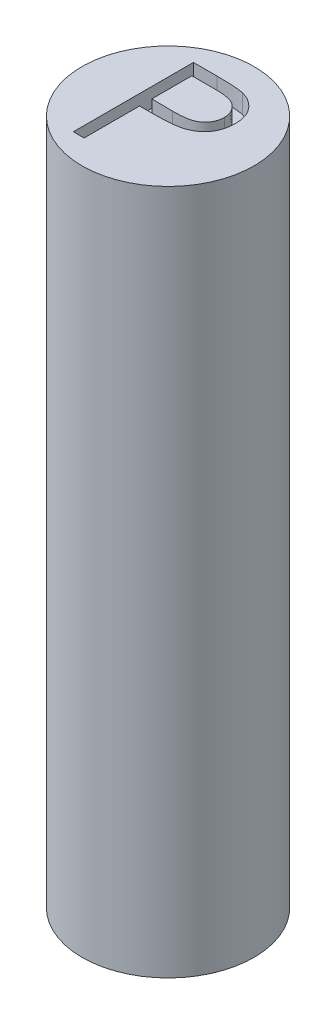
ISO-10303-21;
HEADER;
FILE_DESCRIPTION(('STEP AP214'),'2;1');
FILE_NAME('part.step','',(''),(''),'','','');
FILE_SCHEMA(('AUTOMOTIVE_DESIGN { 1 0 10303 214 1 1 1 1 }'));
ENDSEC;
DATA;
#1=APPLICATION_CONTEXT('core data for automotive mechanical design processes');
#2=APPLICATION_PROTOCOL_DEFINITION('international standard','automotive_design',2000,#1);
#3=PRODUCT_CONTEXT('',#1,'mechanical');
#4=PRODUCT('Part','Part','',(#3));
#5=PRODUCT_RELATED_PRODUCT_CATEGORY('part','',(#4));
#6=PRODUCT_DEFINITION_FORMATION('','',#4);
#7=PRODUCT_DEFINITION_CONTEXT('part definition',#1,'design');
#8=PRODUCT_DEFINITION('design','',#6,#7);
#9=PRODUCT_DEFINITION_SHAPE('','',#8);
#10=(LENGTH_UNIT() NAMED_UNIT(*) SI_UNIT(.MILLI.,.METRE.));
#11=(NAMED_UNIT(*) PLANE_ANGLE_UNIT() SI_UNIT($,.RADIAN.));
#12=(NAMED_UNIT(*) SI_UNIT($,.STERADIAN.) SOLID_ANGLE_UNIT());
#13=UNCERTAINTY_MEASURE_WITH_UNIT(LENGTH_MEASURE(1.E-05),#10,'distance_accuracy_value','');
#14=(GEOMETRIC_REPRESENTATION_CONTEXT(3) GLOBAL_UNCERTAINTY_ASSIGNED_CONTEXT((#13)) GLOBAL_UNIT_ASSIGNED_CONTEXT((#10,
#11,#12)) REPRESENTATION_CONTEXT('',''));
#15=CARTESIAN_POINT('',(0.,0.,0.));
#16=DIRECTION('',(0.,0.,1.));
#17=DIRECTION('',(1.,0.,0.));
#18=AXIS2_PLACEMENT_3D('',#15,#16,#17);
#19=CARTESIAN_POINT('',(0.,72.5,0.));
#20=DIRECTION('',(0.,1.,0.));
#21=DIRECTION('',(0.,0.,1.));
#22=AXIS2_PLACEMENT_3D('',#19,#20,#21);
#23=PLANE('',#22);
#24=CARTESIAN_POINT('',(0.,72.5,0.));
#25=DIRECTION('',(0.,1.,0.));
#26=DIRECTION('',(0.,0.,1.));
#27=AXIS2_PLACEMENT_3D('',#24,#25,#26);
#28=CIRCLE('',#27,9.1);
#29=CARTESIAN_POINT('',(0.,72.5,9.1));
#30=VERTEX_POINT('',#29);
#31=EDGE_CURVE('E11',#30,#30,#28,.T.);
#32=ORIENTED_EDGE('',*,*,#31,.T.);
#33=EDGE_LOOP('',(#32));
#34=FACE_BOUND('',#33,.T.);
#35=DIRECTION('',(-1.,0.,0.));
#36=VECTOR('',#35,1.);
#37=CARTESIAN_POINT('',(-2.44230769230769,72.5,6.43467170879758));
#38=LINE('',#37,#36);
#39=CARTESIAN_POINT('',(-2.44230769230769,72.5,6.43467170879758));
#40=VERTEX_POINT('',#39);
#41=CARTESIAN_POINT('',(-3.58205128205128,72.5,6.43467170879758));
#42=VERTEX_POINT('',#41);
#43=EDGE_CURVE('E281',#40,#42,#38,.T.);
#44=ORIENTED_EDGE('',*,*,#43,.T.);
#45=DIRECTION('',(0.,0.,-1.));
#46=VECTOR('',#45,1.);
#47=CARTESIAN_POINT('',(-3.58205128205128,72.5,6.43467170879758));
#48=LINE('',#47,#46);
#49=CARTESIAN_POINT('',(-3.58205128205128,72.5,-6.26532829120242));
#50=VERTEX_POINT('',#49);
#51=EDGE_CURVE('E47',#42,#50,#48,.T.);
#52=ORIENTED_EDGE('',*,*,#51,.T.);
#53=DIRECTION('',(1.,0.,0.));
#54=VECTOR('',#53,1.);
#55=CARTESIAN_POINT('',(-3.58205128205128,72.5,-6.26532829120242));
#56=LINE('',#55,#54);
#57=CARTESIAN_POINT('',(-1.09140625,72.5,-6.26532829120242));
#58=VERTEX_POINT('',#57);
#59=EDGE_CURVE('E240',#50,#58,#56,.T.);
#60=ORIENTED_EDGE('',*,*,#59,.T.);
#61=CARTESIAN_POINT('',(-1.09140625,72.5,-6.26532829120242));
#62=CARTESIAN_POINT('',(-0.920098104821111,72.5,-6.26513998198564));
#63=CARTESIAN_POINT('',(-0.591864090908021,72.5,-6.26477917316353));
#64=CARTESIAN_POINT('',(-0.121183745907202,72.5,-6.25383995259619));
#65=CARTESIAN_POINT('',(0.306297280279791,72.5,-6.23922881271673));
#66=CARTESIAN_POINT('',(0.689657233928184,72.5,-6.21897451455883));
#67=CARTESIAN_POINT('',(1.03007564698521,72.5,-6.19503831566073));
#68=CARTESIAN_POINT('',(1.32601213391129,72.5,-6.16146662991978));
#69=CARTESIAN_POINT('',(1.57979280975124,72.5,-6.12641355748342));
#70=CARTESIAN_POINT('',(1.73185335488574,72.5,-6.09077588239876));
#71=CARTESIAN_POINT('',(1.80120192307692,72.5,-6.07452300274088));
#72=B_SPLINE_CURVE_WITH_KNOTS('',3,(#61,#62,#63,#64,#65,#66,#67,#68,#69,#70,#71),.UNSPECIFIED.,
.F.,.F.,(4,1,1,1,1,1,1,1,4),(0.,0.176955752131251,0.339055079642581,0.486318224942077,
0.618780922835378,0.735618827767381,0.838742476720111,0.926457067876317,1.),.UNSPECIFIED.);
#73=CARTESIAN_POINT('',(1.80120192307692,72.5,-6.07452300274088));
#74=VERTEX_POINT('',#73);
#75=EDGE_CURVE('E243',#58,#74,#72,.T.);
#76=ORIENTED_EDGE('',*,*,#75,.T.);
#77=CARTESIAN_POINT('',(1.80120192307692,72.5,-6.07452300274088));
#78=CARTESIAN_POINT('',(1.88898988852641,72.5,-6.05049478478014));
#79=CARTESIAN_POINT('',(2.06249720583904,72.5,-6.0030045437565));
#80=CARTESIAN_POINT('',(2.31250956223637,72.5,-5.90788617571631));
#81=CARTESIAN_POINT('',(2.55037637297944,72.5,-5.79510231922238));
#82=CARTESIAN_POINT('',(2.77691374219481,72.5,-5.66656402319198));
#83=CARTESIAN_POINT('',(2.98933787219484,72.5,-5.51675640457007));
#84=CARTESIAN_POINT('',(3.19081807798578,72.5,-5.3517521344875));
#85=CARTESIAN_POINT('',(3.3795762922016,72.5,-5.16774158566754));
#86=CARTESIAN_POINT('',(3.55455105703846,72.5,-4.96678861536399));
#87=CARTESIAN_POINT('',(3.71524160827164,72.5,-4.75226671093685));
#88=CARTESIAN_POINT('',(3.85359788559597,72.5,-4.52097347670111));
#89=CARTESIAN_POINT('',(3.96944810940238,72.5,-4.27680217572056));
#90=CARTESIAN_POINT('',(4.06881026593061,72.5,-4.01992264609249));
#91=CARTESIAN_POINT('',(4.14032380071884,72.5,-3.74817775799536));
#92=CARTESIAN_POINT('',(4.19419683679291,72.5,-3.46345568738045));
#93=CARTESIAN_POINT('',(4.22839114271255,72.5,-3.16578695436359));
#94=CARTESIAN_POINT('',(4.23166615250978,72.5,-2.96236972078789));
#95=CARTESIAN_POINT('',(4.23333333333334,72.5,-2.85881787453575));
#96=B_SPLINE_CURVE_WITH_KNOTS('',3,(#77,#78,#79,#80,#81,#82,#83,#84,#85,#86,#87,#88,#89,#90,#91,
#92,#93,#94,#95),.UNSPECIFIED.,.F.,.F.,(4,1,1,1,1,1,1,1,1,1,1,1,1,1,1,1,4),(0.,
0.0624813386352052,0.123490382687291,0.183411094206311,0.24315322099978,0.302126735372088,
0.361709670832906,0.42184229169488,0.482931901446669,0.544552254431324,0.605680719965358,
0.667679738343688,0.729984387538063,0.794550921286129,0.860345619712083,0.928907356265709,1.),.UNSPECIFIED.);
#97=CARTESIAN_POINT('',(4.23333333333334,72.5,-2.85881787453575));
#98=VERTEX_POINT('',#97);
#99=EDGE_CURVE('E248',#74,#98,#96,.T.);
#100=ORIENTED_EDGE('',*,*,#99,.T.);
#101=CARTESIAN_POINT('',(4.23333333333334,72.5,-2.85881787453575));
#102=CARTESIAN_POINT('',(4.23180416360254,72.5,-2.75439565590688));
#103=CARTESIAN_POINT('',(4.22881223974359,72.5,-2.5500865324476));
#104=CARTESIAN_POINT('',(4.19290286155038,72.5,-2.25119098673435));
#105=CARTESIAN_POINT('',(4.14453330910533,72.5,-1.9655556853997));
#106=CARTESIAN_POINT('',(4.07015829066092,72.5,-1.69381396512494));
#107=CARTESIAN_POINT('',(3.97274684827528,72.5,-1.43757959798816));
#108=CARTESIAN_POINT('',(3.85847568509235,72.5,-1.19293684179862));
#109=CARTESIAN_POINT('',(3.72064973203631,72.5,-0.964047746623712));
#110=CARTESIAN_POINT('',(3.56228134994392,72.5,-0.750081348686854));
#111=CARTESIAN_POINT('',(3.38610842171828,72.5,-0.550836809718299));
#112=CARTESIAN_POINT('',(3.19287633186965,72.5,-0.367757983987628));
#113=CARTESIAN_POINT('',(2.98336518479725,72.5,-0.201916527425883));
#114=CARTESIAN_POINT('',(2.75824081892016,72.5,-0.0529406517856198));
#115=CARTESIAN_POINT('',(2.51530851028471,72.5,0.0757149909631279));
#116=CARTESIAN_POINT('',(2.25825269589871,72.5,0.190948640264351));
#117=CARTESIAN_POINT('',(1.98483905345345,72.5,0.287726488866887));
#118=CARTESIAN_POINT('',(1.79563621702854,72.5,0.338635568899814));
#119=CARTESIAN_POINT('',(1.6994391025641,72.5,0.36451946520784));
#120=B_SPLINE_CURVE_WITH_KNOTS('',3,(#101,#102,#103,#104,#105,#106,#107,#108,#109,#110,#111,
#112,#113,#114,#115,#116,#117,#118,#119),.UNSPECIFIED.,.F.,.F.,(4,1,1,1,1,1,1,1,1,1,1,1,1,1,1,1,
4),(0.,0.0701188944197149,0.137192352785971,0.202016180724751,0.264631406974743,
0.326116547145818,0.386010304667641,0.44581184695768,0.50529769673096,0.564633277726488,
0.62428262533384,0.683902031903751,0.74395277093827,0.805387731007635,0.86838803089628,
0.933084028252477,1.),.UNSPECIFIED.);
#121=CARTESIAN_POINT('',(1.6994391025641,72.5,0.36451946520784));
#122=VERTEX_POINT('',#121);
#123=EDGE_CURVE('E256',#98,#122,#120,.T.);
#124=ORIENTED_EDGE('',*,*,#123,.T.);
#125=CARTESIAN_POINT('',(1.6994391025641,72.5,0.36451946520784));
#126=CARTESIAN_POINT('',(1.61987420493812,72.5,0.381439425119047));
#127=CARTESIAN_POINT('',(1.44550310565819,72.5,0.418520501039717));
#128=CARTESIAN_POINT('',(1.15832808518465,72.5,0.459916901591152));
#129=CARTESIAN_POINT('',(0.823971970525023,72.5,0.495250481221207));
#130=CARTESIAN_POINT('',(0.442891126259966,72.5,0.521743180443899));
#131=CARTESIAN_POINT('',(0.0154276141159625,72.5,0.544423088863187));
#132=CARTESIAN_POINT('',(-0.458649805337677,72.5,0.562450172409361));
#133=CARTESIAN_POINT('',(-0.980271742531171,72.5,0.572355642039793));
#134=CARTESIAN_POINT('',(-1.34411311389976,72.5,0.572866518765746));
#135=CARTESIAN_POINT('',(-1.53407451923077,72.5,0.573133247259122));
#136=B_SPLINE_CURVE_WITH_KNOTS('',3,(#125,#126,#127,#128,#129,#130,#131,#132,#133,#134,#135),
.UNSPECIFIED.,.F.,.F.,(4,1,1,1,1,1,1,1,4),(0.,0.0751731173762218,0.164746257511801,
0.26801688098778,0.385911875652956,0.517789479273397,0.663690977002281,0.824413220536641,1.),.UNSPECIFIED.);
#137=CARTESIAN_POINT('',(-1.53407451923077,72.5,0.573133247259122));
#138=VERTEX_POINT('',#137);
#139=EDGE_CURVE('E264',#122,#138,#136,.T.);
#140=ORIENTED_EDGE('',*,*,#139,.T.);
#141=DIRECTION('',(-1.,0.,0.));
#142=VECTOR('',#141,1.);
#143=CARTESIAN_POINT('',(-1.53407451923077,72.5,0.573133247259122));
#144=LINE('',#143,#142);
#145=CARTESIAN_POINT('',(-2.44230769230769,72.5,0.573133247259122));
#146=VERTEX_POINT('',#145);
#147=EDGE_CURVE('E272',#138,#146,#144,.T.);
#148=ORIENTED_EDGE('',*,*,#147,.T.);
#149=DIRECTION('',(0.,0.,1.));
#150=VECTOR('',#149,1.);
#151=CARTESIAN_POINT('',(-2.44230769230769,72.5,0.573133247259122));
#152=LINE('',#151,#150);
#153=EDGE_CURVE('E278',#146,#40,#152,.T.);
#154=ORIENTED_EDGE('',*,*,#153,.T.);
#155=EDGE_LOOP('',(#44,#52,#60,#76,#100,#124,#140,#148,#154));
#156=FACE_BOUND('',#155,.T.);
#157=ADVANCED_FACE('F32',(#34,#156),#23,.T.);
#158=CARTESIAN_POINT('',(0.,72.5,0.));
#159=DIRECTION('',(0.,-1.,0.));
#160=DIRECTION('',(0.,0.,-1.));
#161=AXIS2_PLACEMENT_3D('',#158,#159,#160);
#162=CYLINDRICAL_SURFACE('',#161,9.1);
#163=ORIENTED_EDGE('',*,*,#31,.F.);
#164=EDGE_LOOP('',(#163));
#165=FACE_BOUND('',#164,.T.);
#166=CARTESIAN_POINT('',(0.,0.,0.));
#167=DIRECTION('',(0.,1.,0.));
#168=DIRECTION('',(0.,0.,1.));
#169=AXIS2_PLACEMENT_3D('',#166,#167,#168);
#170=CIRCLE('',#169,9.1);
#171=CARTESIAN_POINT('',(0.,0.,9.1));
#172=VERTEX_POINT('',#171);
#173=EDGE_CURVE('E36',#172,#172,#170,.T.);
#174=ORIENTED_EDGE('',*,*,#173,.T.);
#175=EDGE_LOOP('',(#174));
#176=FACE_BOUND('',#175,.T.);
#177=ADVANCED_FACE('F34',(#165,#176),#162,.T.);
#178=CARTESIAN_POINT('',(0.,0.,0.));
#179=DIRECTION('',(0.,1.,0.));
#180=DIRECTION('',(0.,0.,1.));
#181=AXIS2_PLACEMENT_3D('',#178,#179,#180);
#182=PLANE('',#181);
#183=ORIENTED_EDGE('',*,*,#173,.F.);
#184=EDGE_LOOP('',(#183));
#185=FACE_BOUND('',#184,.T.);
#186=ADVANCED_FACE('F307',(#185),#182,.F.);
#187=CARTESIAN_POINT('',(-3.58205128205128,70.5,6.43467170879758));
#188=DIRECTION('',(1.,0.,0.));
#189=DIRECTION('',(0.,0.,-1.));
#190=AXIS2_PLACEMENT_3D('',#187,#188,#189);
#191=PLANE('',#190);
#192=ORIENTED_EDGE('',*,*,#51,.F.);
#193=DIRECTION('',(0.,1.,0.));
#194=VECTOR('',#193,1.);
#195=CARTESIAN_POINT('',(-3.58205128205128,70.5,6.43467170879758));
#196=LINE('',#195,#194);
#197=CARTESIAN_POINT('',(-3.58205128205128,70.5,6.43467170879758));
#198=VERTEX_POINT('',#197);
#199=EDGE_CURVE('E238',#198,#42,#196,.T.);
#200=ORIENTED_EDGE('',*,*,#199,.F.);
#201=DIRECTION('',(0.,0.,-1.));
#202=VECTOR('',#201,1.);
#203=CARTESIAN_POINT('',(-3.58205128205128,70.5,6.43467170879758));
#204=LINE('',#203,#202);
#205=CARTESIAN_POINT('',(-3.58205128205128,70.5,-6.26532829120242));
#206=VERTEX_POINT('',#205);
#207=EDGE_CURVE('E284',#198,#206,#204,.T.);
#208=ORIENTED_EDGE('',*,*,#207,.T.);
#209=DIRECTION('',(0.,1.,0.));
#210=VECTOR('',#209,1.);
#211=CARTESIAN_POINT('',(-3.58205128205128,70.5,-6.26532829120242));
#212=LINE('',#211,#210);
#213=EDGE_CURVE('E300',#206,#50,#212,.T.);
#214=ORIENTED_EDGE('',*,*,#213,.T.);
#215=EDGE_LOOP('',(#192,#200,#208,#214));
#216=FACE_BOUND('',#215,.T.);
#217=ADVANCED_FACE('F309',(#216),#191,.T.);
#218=CARTESIAN_POINT('',(-3.58205128205128,70.5,-6.26532829120242));
#219=DIRECTION('',(0.,0.,1.));
#220=DIRECTION('',(1.,0.,0.));
#221=AXIS2_PLACEMENT_3D('',#218,#219,#220);
#222=PLANE('',#221);
#223=ORIENTED_EDGE('',*,*,#59,.F.);
#224=ORIENTED_EDGE('',*,*,#213,.F.);
#225=DIRECTION('',(1.,0.,0.));
#226=VECTOR('',#225,1.);
#227=CARTESIAN_POINT('',(-3.58205128205128,70.5,-6.26532829120242));
#228=LINE('',#227,#226);
#229=CARTESIAN_POINT('',(-1.09140625,70.5,-6.26532829120242));
#230=VERTEX_POINT('',#229);
#231=EDGE_CURVE('E353',#206,#230,#228,.T.);
#232=ORIENTED_EDGE('',*,*,#231,.T.);
#233=DIRECTION('',(0.,1.,0.));
#234=VECTOR('',#233,1.);
#235=CARTESIAN_POINT('',(-1.09140625,70.5,-6.26532829120242));
#236=LINE('',#235,#234);
#237=EDGE_CURVE('E298',#230,#58,#236,.T.);
#238=ORIENTED_EDGE('',*,*,#237,.T.);
#239=EDGE_LOOP('',(#223,#224,#232,#238));
#240=FACE_BOUND('',#239,.T.);
#241=ADVANCED_FACE('F314',(#240),#222,.T.);
#242=CARTESIAN_POINT('',(-1.09140625,70.5,-6.26532829120242));
#243=CARTESIAN_POINT('',(-0.920098104821111,70.5,-6.26513998198564));
#244=CARTESIAN_POINT('',(-0.591864090908021,70.5,-6.26477917316353));
#245=CARTESIAN_POINT('',(-0.121183745907202,70.5,-6.25383995259619));
#246=CARTESIAN_POINT('',(0.306297280279791,70.5,-6.23922881271673));
#247=CARTESIAN_POINT('',(0.689657233928184,70.5,-6.21897451455883));
#248=CARTESIAN_POINT('',(1.03007564698521,70.5,-6.19503831566073));
#249=CARTESIAN_POINT('',(1.32601213391129,70.5,-6.16146662991978));
#250=CARTESIAN_POINT('',(1.57979280975124,70.5,-6.12641355748342));
#251=CARTESIAN_POINT('',(1.73185335488574,70.5,-6.09077588239876));
#252=CARTESIAN_POINT('',(1.80120192307692,70.5,-6.07452300274088));
#253=B_SPLINE_CURVE_WITH_KNOTS('',3,(#242,#243,#244,#245,#246,#247,#248,#249,#250,#251,#252),
.UNSPECIFIED.,.F.,.F.,(4,1,1,1,1,1,1,1,4),(0.,0.176955752131251,0.339055079642581,
0.486318224942077,0.618780922835378,0.735618827767381,0.838742476720111,0.926457067876317,1.),.UNSPECIFIED.);
#254=DIRECTION('',(0.,1.,0.));
#255=VECTOR('',#254,1.);
#256=SURFACE_OF_LINEAR_EXTRUSION('',#253,#255);
#257=ORIENTED_EDGE('',*,*,#75,.F.);
#258=ORIENTED_EDGE('',*,*,#237,.F.);
#259=CARTESIAN_POINT('',(1.80120192307692,70.5,-6.07452300274088));
#260=VERTEX_POINT('',#259);
#261=EDGE_CURVE('E355',#230,#260,#253,.T.);
#262=ORIENTED_EDGE('',*,*,#261,.T.);
#263=DIRECTION('',(0.,1.,0.));
#264=VECTOR('',#263,1.);
#265=CARTESIAN_POINT('',(1.80120192307692,70.5,-6.07452300274088));
#266=LINE('',#265,#264);
#267=EDGE_CURVE('E296',#260,#74,#266,.T.);
#268=ORIENTED_EDGE('',*,*,#267,.T.);
#269=EDGE_LOOP('',(#257,#258,#262,#268));
#270=FACE_BOUND('',#269,.T.);
#271=ADVANCED_FACE('F367',(#270),#256,.T.);
#272=CARTESIAN_POINT('',(1.80120192307692,70.5,-6.07452300274088));
#273=CARTESIAN_POINT('',(1.88898988852641,70.5,-6.05049478478014));
#274=CARTESIAN_POINT('',(2.06249720583904,70.5,-6.0030045437565));
#275=CARTESIAN_POINT('',(2.31250956223637,70.5,-5.90788617571631));
#276=CARTESIAN_POINT('',(2.55037637297944,70.5,-5.79510231922238));
#277=CARTESIAN_POINT('',(2.77691374219481,70.5,-5.66656402319198));
#278=CARTESIAN_POINT('',(2.98933787219484,70.5,-5.51675640457007));
#279=CARTESIAN_POINT('',(3.19081807798578,70.5,-5.3517521344875));
#280=CARTESIAN_POINT('',(3.3795762922016,70.5,-5.16774158566754));
#281=CARTESIAN_POINT('',(3.55455105703846,70.5,-4.96678861536399));
#282=CARTESIAN_POINT('',(3.71524160827164,70.5,-4.75226671093685));
#283=CARTESIAN_POINT('',(3.85359788559597,70.5,-4.52097347670111));
#284=CARTESIAN_POINT('',(3.96944810940238,70.5,-4.27680217572056));
#285=CARTESIAN_POINT('',(4.06881026593061,70.5,-4.01992264609249));
#286=CARTESIAN_POINT('',(4.14032380071884,70.5,-3.74817775799536));
#287=CARTESIAN_POINT('',(4.19419683679291,70.5,-3.46345568738045));
#288=CARTESIAN_POINT('',(4.22839114271255,70.5,-3.16578695436359));
#289=CARTESIAN_POINT('',(4.23166615250978,70.5,-2.96236972078789));
#290=CARTESIAN_POINT('',(4.23333333333334,70.5,-2.85881787453575));
#291=B_SPLINE_CURVE_WITH_KNOTS('',3,(#272,#273,#274,#275,#276,#277,#278,#279,#280,#281,#282,
#283,#284,#285,#286,#287,#288,#289,#290),.UNSPECIFIED.,.F.,.F.,(4,1,1,1,1,1,1,1,1,1,1,1,1,1,1,1,
4),(0.,0.0624813386352052,0.123490382687291,0.183411094206311,0.24315322099978,
0.302126735372088,0.361709670832906,0.42184229169488,0.482931901446669,0.544552254431324,
0.605680719965358,0.667679738343688,0.729984387538063,0.794550921286129,0.860345619712083,
0.928907356265709,1.),.UNSPECIFIED.);
#292=DIRECTION('',(0.,1.,0.));
#293=VECTOR('',#292,1.);
#294=SURFACE_OF_LINEAR_EXTRUSION('',#291,#293);
#295=ORIENTED_EDGE('',*,*,#99,.F.);
#296=ORIENTED_EDGE('',*,*,#267,.F.);
#297=CARTESIAN_POINT('',(4.23333333333334,70.5,-2.85881787453575));
#298=VERTEX_POINT('',#297);
#299=EDGE_CURVE('E359',#260,#298,#291,.T.);
#300=ORIENTED_EDGE('',*,*,#299,.T.);
#301=DIRECTION('',(0.,1.,0.));
#302=VECTOR('',#301,1.);
#303=CARTESIAN_POINT('',(4.23333333333334,70.5,-2.85881787453575));
#304=LINE('',#303,#302);
#305=EDGE_CURVE('E294',#298,#98,#304,.T.);
#306=ORIENTED_EDGE('',*,*,#305,.T.);
#307=EDGE_LOOP('',(#295,#296,#300,#306));
#308=FACE_BOUND('',#307,.T.);
#309=ADVANCED_FACE('F370',(#308),#294,.T.);
#310=CARTESIAN_POINT('',(4.23333333333334,70.5,-2.85881787453575));
#311=CARTESIAN_POINT('',(4.23180416360254,70.5,-2.75439565590688));
#312=CARTESIAN_POINT('',(4.22881223974359,70.5,-2.5500865324476));
#313=CARTESIAN_POINT('',(4.19290286155038,70.5,-2.25119098673435));
#314=CARTESIAN_POINT('',(4.14453330910533,70.5,-1.9655556853997));
#315=CARTESIAN_POINT('',(4.07015829066092,70.5,-1.69381396512494));
#316=CARTESIAN_POINT('',(3.97274684827528,70.5,-1.43757959798816));
#317=CARTESIAN_POINT('',(3.85847568509235,70.5,-1.19293684179862));
#318=CARTESIAN_POINT('',(3.72064973203631,70.5,-0.964047746623712));
#319=CARTESIAN_POINT('',(3.56228134994392,70.5,-0.750081348686854));
#320=CARTESIAN_POINT('',(3.38610842171828,70.5,-0.550836809718299));
#321=CARTESIAN_POINT('',(3.19287633186965,70.5,-0.367757983987628));
#322=CARTESIAN_POINT('',(2.98336518479725,70.5,-0.201916527425883));
#323=CARTESIAN_POINT('',(2.75824081892016,70.5,-0.0529406517856198));
#324=CARTESIAN_POINT('',(2.51530851028471,70.5,0.0757149909631279));
#325=CARTESIAN_POINT('',(2.25825269589871,70.5,0.190948640264351));
#326=CARTESIAN_POINT('',(1.98483905345345,70.5,0.287726488866887));
#327=CARTESIAN_POINT('',(1.79563621702854,70.5,0.338635568899814));
#328=CARTESIAN_POINT('',(1.6994391025641,70.5,0.36451946520784));
#329=B_SPLINE_CURVE_WITH_KNOTS('',3,(#310,#311,#312,#313,#314,#315,#316,#317,#318,#319,#320,
#321,#322,#323,#324,#325,#326,#327,#328),.UNSPECIFIED.,.F.,.F.,(4,1,1,1,1,1,1,1,1,1,1,1,1,1,1,1,
4),(0.,0.0701188944197149,0.137192352785971,0.202016180724751,0.264631406974743,
0.326116547145818,0.386010304667641,0.44581184695768,0.50529769673096,0.564633277726488,
0.62428262533384,0.683902031903751,0.74395277093827,0.805387731007635,0.86838803089628,
0.933084028252477,1.),.UNSPECIFIED.);
#330=DIRECTION('',(0.,1.,0.));
#331=VECTOR('',#330,1.);
#332=SURFACE_OF_LINEAR_EXTRUSION('',#329,#331);
#333=ORIENTED_EDGE('',*,*,#123,.F.);
#334=ORIENTED_EDGE('',*,*,#305,.F.);
#335=CARTESIAN_POINT('',(1.6994391025641,70.5,0.36451946520784));
#336=VERTEX_POINT('',#335);
#337=EDGE_CURVE('E225',#298,#336,#329,.T.);
#338=ORIENTED_EDGE('',*,*,#337,.T.);
#339=DIRECTION('',(0.,1.,0.));
#340=VECTOR('',#339,1.);
#341=CARTESIAN_POINT('',(1.6994391025641,70.5,0.36451946520784));
#342=LINE('',#341,#340);
#343=EDGE_CURVE('E292',#336,#122,#342,.T.);
#344=ORIENTED_EDGE('',*,*,#343,.T.);
#345=EDGE_LOOP('',(#333,#334,#338,#344));
#346=FACE_BOUND('',#345,.T.);
#347=ADVANCED_FACE('F215',(#346),#332,.T.);
#348=CARTESIAN_POINT('',(1.6994391025641,70.5,0.36451946520784));
#349=CARTESIAN_POINT('',(1.61987420493812,70.5,0.381439425119047));
#350=CARTESIAN_POINT('',(1.44550310565819,70.5,0.418520501039717));
#351=CARTESIAN_POINT('',(1.15832808518465,70.5,0.459916901591152));
#352=CARTESIAN_POINT('',(0.823971970525023,70.5,0.495250481221207));
#353=CARTESIAN_POINT('',(0.442891126259966,70.5,0.521743180443899));
#354=CARTESIAN_POINT('',(0.0154276141159625,70.5,0.544423088863187));
#355=CARTESIAN_POINT('',(-0.458649805337677,70.5,0.562450172409361));
#356=CARTESIAN_POINT('',(-0.980271742531171,70.5,0.572355642039793));
#357=CARTESIAN_POINT('',(-1.34411311389976,70.5,0.572866518765746));
#358=CARTESIAN_POINT('',(-1.53407451923077,70.5,0.573133247259122));
#359=B_SPLINE_CURVE_WITH_KNOTS('',3,(#348,#349,#350,#351,#352,#353,#354,#355,#356,#357,#358),
.UNSPECIFIED.,.F.,.F.,(4,1,1,1,1,1,1,1,4),(0.,0.0751731173762218,0.164746257511801,
0.26801688098778,0.385911875652956,0.517789479273397,0.663690977002281,0.824413220536641,1.),.UNSPECIFIED.);
#360=DIRECTION('',(0.,1.,0.));
#361=VECTOR('',#360,1.);
#362=SURFACE_OF_LINEAR_EXTRUSION('',#359,#361);
#363=ORIENTED_EDGE('',*,*,#139,.F.);
#364=ORIENTED_EDGE('',*,*,#343,.F.);
#365=CARTESIAN_POINT('',(-1.53407451923077,70.5,0.573133247259122));
#366=VERTEX_POINT('',#365);
#367=EDGE_CURVE('E219',#336,#366,#359,.T.);
#368=ORIENTED_EDGE('',*,*,#367,.T.);
#369=DIRECTION('',(0.,1.,0.));
#370=VECTOR('',#369,1.);
#371=CARTESIAN_POINT('',(-1.53407451923077,70.5,0.573133247259122));
#372=LINE('',#371,#370);
#373=EDGE_CURVE('E290',#366,#138,#372,.T.);
#374=ORIENTED_EDGE('',*,*,#373,.T.);
#375=EDGE_LOOP('',(#363,#364,#368,#374));
#376=FACE_BOUND('',#375,.T.);
#377=ADVANCED_FACE('F210',(#376),#362,.T.);
#378=CARTESIAN_POINT('',(-1.53407451923077,70.5,0.573133247259122));
#379=DIRECTION('',(0.,0.,-1.));
#380=DIRECTION('',(-1.,0.,0.));
#381=AXIS2_PLACEMENT_3D('',#378,#379,#380);
#382=PLANE('',#381);
#383=ORIENTED_EDGE('',*,*,#147,.F.);
#384=ORIENTED_EDGE('',*,*,#373,.F.);
#385=DIRECTION('',(-1.,0.,0.));
#386=VECTOR('',#385,1.);
#387=CARTESIAN_POINT('',(-1.53407451923077,70.5,0.573133247259122));
#388=LINE('',#387,#386);
#389=CARTESIAN_POINT('',(-2.44230769230769,70.5,0.573133247259122));
#390=VERTEX_POINT('',#389);
#391=EDGE_CURVE('E224',#366,#390,#388,.T.);
#392=ORIENTED_EDGE('',*,*,#391,.T.);
#393=DIRECTION('',(0.,1.,0.));
#394=VECTOR('',#393,1.);
#395=CARTESIAN_POINT('',(-2.44230769230769,70.5,0.573133247259122));
#396=LINE('',#395,#394);
#397=EDGE_CURVE('E288',#390,#146,#396,.T.);
#398=ORIENTED_EDGE('',*,*,#397,.T.);
#399=EDGE_LOOP('',(#383,#384,#392,#398));
#400=FACE_BOUND('',#399,.T.);
#401=ADVANCED_FACE('F206',(#400),#382,.T.);
#402=CARTESIAN_POINT('',(-2.44230769230769,70.5,0.573133247259122));
#403=DIRECTION('',(-1.,0.,0.));
#404=DIRECTION('',(0.,0.,1.));
#405=AXIS2_PLACEMENT_3D('',#402,#403,#404);
#406=PLANE('',#405);
#407=ORIENTED_EDGE('',*,*,#153,.F.);
#408=ORIENTED_EDGE('',*,*,#397,.F.);
#409=DIRECTION('',(0.,0.,1.));
#410=VECTOR('',#409,1.);
#411=CARTESIAN_POINT('',(-2.44230769230769,70.5,0.573133247259122));
#412=LINE('',#411,#410);
#413=CARTESIAN_POINT('',(-2.44230769230769,70.5,6.43467170879758));
#414=VERTEX_POINT('',#413);
#415=EDGE_CURVE('E234',#390,#414,#412,.T.);
#416=ORIENTED_EDGE('',*,*,#415,.T.);
#417=DIRECTION('',(0.,1.,0.));
#418=VECTOR('',#417,1.);
#419=CARTESIAN_POINT('',(-2.44230769230769,70.5,6.43467170879758));
#420=LINE('',#419,#418);
#421=EDGE_CURVE('E286',#414,#40,#420,.T.);
#422=ORIENTED_EDGE('',*,*,#421,.T.);
#423=EDGE_LOOP('',(#407,#408,#416,#422));
#424=FACE_BOUND('',#423,.T.);
#425=ADVANCED_FACE('F202',(#424),#406,.T.);
#426=CARTESIAN_POINT('',(-2.44230769230769,70.5,6.43467170879758));
#427=DIRECTION('',(0.,0.,-1.));
#428=DIRECTION('',(-1.,0.,0.));
#429=AXIS2_PLACEMENT_3D('',#426,#427,#428);
#430=PLANE('',#429);
#431=ORIENTED_EDGE('',*,*,#43,.F.);
#432=ORIENTED_EDGE('',*,*,#421,.F.);
#433=DIRECTION('',(-1.,0.,0.));
#434=VECTOR('',#433,1.);
#435=CARTESIAN_POINT('',(-2.44230769230769,70.5,6.43467170879758));
#436=LINE('',#435,#434);
#437=EDGE_CURVE('E236',#414,#198,#436,.T.);
#438=ORIENTED_EDGE('',*,*,#437,.T.);
#439=ORIENTED_EDGE('',*,*,#199,.T.);
#440=EDGE_LOOP('',(#431,#432,#438,#439));
#441=FACE_BOUND('',#440,.T.);
#442=ADVANCED_FACE('F199',(#441),#430,.T.);
#443=CARTESIAN_POINT('',(0.36024604587461,70.5,-6.23556088905053));
#444=DIRECTION('',(0.,1.,0.));
#445=DIRECTION('',(0.,0.,1.));
#446=AXIS2_PLACEMENT_3D('',#443,#444,#445);
#447=PLANE('',#446);
#448=CARTESIAN_POINT('',(3.09358974358975,70.5,-2.85372973351011));
#449=CARTESIAN_POINT('',(3.08900814059166,70.5,-2.95583233945312));
#450=CARTESIAN_POINT('',(3.0799004808764,70.5,-3.15879968327573));
#451=CARTESIAN_POINT('',(3.01220634883623,70.5,-3.45626547177385));
#452=CARTESIAN_POINT('',(2.89845312424568,70.5,-3.74014931340591));
#453=CARTESIAN_POINT('',(2.74076776700608,70.5,-4.00493736597404));
#454=CARTESIAN_POINT('',(2.54939280972036,70.5,-4.24510816893367));
#455=CARTESIAN_POINT('',(2.32696376472854,70.5,-4.4537406014189));
#456=CARTESIAN_POINT('',(2.07400421646064,70.5,-4.62145935132894));
#457=CARTESIAN_POINT('',(1.83869777814186,70.5,-4.72971154473987));
#458=CARTESIAN_POINT('',(1.62968776027082,70.5,-4.79580697274014));
#459=CARTESIAN_POINT('',(1.44814322012108,70.5,-4.84205253668495));
#460=CARTESIAN_POINT('',(1.2431627726992,70.5,-4.8789754507737));
#461=CARTESIAN_POINT('',(1.01467968704732,70.5,-4.90887307520559));
#462=CARTESIAN_POINT('',(0.764464889824117,70.5,-4.93446706307323));
#463=CARTESIAN_POINT('',(0.490368718635083,70.5,-4.95183332332228));
#464=CARTESIAN_POINT('',(0.193429498789884,70.5,-4.96199860738057));
#465=CARTESIAN_POINT('',(-0.0127117154915017,70.5,-4.9625028164548));
#466=CARTESIAN_POINT('',(-0.119571314102562,70.5,-4.96276418863831));
#467=B_SPLINE_CURVE_WITH_KNOTS('',3,(#448,#449,#450,#451,#452,#453,#454,#455,#456,#457,#458,
#459,#460,#461,#462,#463,#464,#465,#466),.UNSPECIFIED.,.F.,.F.,(4,1,1,1,1,1,1,1,1,1,1,1,1,1,1,1,
4),(0.,0.0700437554181556,0.139238316762646,0.208197455044138,0.279173374424568,
0.349986811686477,0.418353845662656,0.487609583757151,0.557411073108388,0.595330156763241,
0.63796405156522,0.685912777711293,0.738185164652479,0.796102647184943,0.858516543946927,
0.926657726468519,1.),.UNSPECIFIED.);
#468=CARTESIAN_POINT('',(3.09358974358975,70.5,-2.85372973351011));
#469=VERTEX_POINT('',#468);
#470=CARTESIAN_POINT('',(-0.119571314102562,70.5,-4.96276418863831));
#471=VERTEX_POINT('',#470);
#472=EDGE_CURVE('E147',#469,#471,#467,.T.);
#473=ORIENTED_EDGE('',*,*,#472,.F.);
#474=CARTESIAN_POINT('',(-0.218790064102563,70.5,-0.701446079663955));
#475=CARTESIAN_POINT('',(-0.11022347615305,70.5,-0.701389968918954));
#476=CARTESIAN_POINT('',(0.0993620836029884,70.5,-0.701281648282547));
#477=CARTESIAN_POINT('',(0.402116379335024,70.5,-0.71574231633574));
#478=CARTESIAN_POINT('',(0.683001507548948,70.5,-0.732435677717969));
#479=CARTESIAN_POINT('',(0.941154681046437,70.5,-0.756877457137229));
#480=CARTESIAN_POINT('',(1.17669227188589,70.5,-0.791426020008416));
#481=CARTESIAN_POINT('',(1.39000701951604,70.5,-0.826302897597132));
#482=CARTESIAN_POINT('',(1.57944487459184,70.5,-0.87675949902608));
#483=CARTESIAN_POINT('',(1.80114769242792,70.5,-0.944697492759469));
#484=CARTESIAN_POINT('',(2.04819298184369,70.5,-1.06056726958647));
#485=CARTESIAN_POINT('',(2.31695237219927,70.5,-1.22875115635229));
#486=CARTESIAN_POINT('',(2.54471992838817,70.5,-1.44312972610695));
#487=CARTESIAN_POINT('',(2.74181774806585,70.5,-1.68416785692025));
#488=CARTESIAN_POINT('',(2.89823050515661,70.5,-1.95231612655194));
#489=CARTESIAN_POINT('',(3.01273367727639,70.5,-2.23922341124352));
#490=CARTESIAN_POINT('',(3.08001159113841,70.5,-2.54194732236513));
#491=CARTESIAN_POINT('',(3.08903292240328,70.5,-2.74909571192535));
#492=CARTESIAN_POINT('',(3.09358974358975,70.5,-2.85372973351011));
#493=B_SPLINE_CURVE_WITH_KNOTS('',3,(#474,#475,#476,#477,#478,#479,#480,#481,#482,#483,#484,
#485,#486,#487,#488,#489,#490,#491,#492),.UNSPECIFIED.,.F.,.F.,(4,1,1,1,1,1,1,1,1,1,1,1,1,1,1,1,
4),(0.,0.0725383714064936,0.140033830501251,0.202495680633623,0.260575055669416,
0.313228337846466,0.361583193753265,0.404878361295127,0.44412743730554,0.516399693337198,
0.586506670997766,0.655085373796049,0.724383783147036,0.793973528725663,0.861637682181777,
0.930110942306404,1.),.UNSPECIFIED.);
#494=CARTESIAN_POINT('',(-0.218790064102563,70.5,-0.701446079663955));
#495=VERTEX_POINT('',#494);
#496=EDGE_CURVE('E169',#495,#469,#493,.T.);
#497=ORIENTED_EDGE('',*,*,#496,.F.);
#498=DIRECTION('',(0.999920808071693,0.,0.0125848156622298));
#499=VECTOR('',#498,1.);
#500=CARTESIAN_POINT('',(-2.44230769230769,70.5,-0.729430855304981));
#501=LINE('',#500,#499);
#502=CARTESIAN_POINT('',(-2.44230769230769,70.5,-0.729430855304981));
#503=VERTEX_POINT('',#502);
#504=EDGE_CURVE('E158',#503,#495,#501,.T.);
#505=ORIENTED_EDGE('',*,*,#504,.F.);
#506=DIRECTION('',(0.,0.,1.));
#507=VECTOR('',#506,1.);
#508=CARTESIAN_POINT('',(-2.44230769230769,70.5,-4.96276418863831));
#509=LINE('',#508,#507);
#510=CARTESIAN_POINT('',(-2.44230769230769,70.5,-4.96276418863831));
#511=VERTEX_POINT('',#510);
#512=EDGE_CURVE('E139',#511,#503,#509,.T.);
#513=ORIENTED_EDGE('',*,*,#512,.F.);
#514=DIRECTION('',(-1.,0.,0.));
#515=VECTOR('',#514,1.);
#516=CARTESIAN_POINT('',(-0.119571314102562,70.5,-4.96276418863831));
#517=LINE('',#516,#515);
#518=EDGE_CURVE('E154',#471,#511,#517,.T.);
#519=ORIENTED_EDGE('',*,*,#518,.F.);
#520=EDGE_LOOP('',(#473,#497,#505,#513,#519));
#521=FACE_BOUND('',#520,.T.);
#522=ORIENTED_EDGE('',*,*,#207,.F.);
#523=ORIENTED_EDGE('',*,*,#437,.F.);
#524=ORIENTED_EDGE('',*,*,#415,.F.);
#525=ORIENTED_EDGE('',*,*,#391,.F.);
#526=ORIENTED_EDGE('',*,*,#367,.F.);
#527=ORIENTED_EDGE('',*,*,#337,.F.);
#528=ORIENTED_EDGE('',*,*,#299,.F.);
#529=ORIENTED_EDGE('',*,*,#261,.F.);
#530=ORIENTED_EDGE('',*,*,#231,.F.);
#531=EDGE_LOOP('',(#522,#523,#524,#525,#526,#527,#528,#529,#530));
#532=FACE_BOUND('',#531,.T.);
#533=ADVANCED_FACE('F152',(#521,#532),#447,.T.);
#534=CARTESIAN_POINT('',(-0.119571314102562,70.5,-4.96276418863831));
#535=DIRECTION('',(0.,0.,-1.));
#536=DIRECTION('',(-1.,0.,0.));
#537=AXIS2_PLACEMENT_3D('',#534,#535,#536);
#538=PLANE('',#537);
#539=DIRECTION('',(-1.,0.,0.));
#540=VECTOR('',#539,1.);
#541=CARTESIAN_POINT('',(-0.119571314102562,72.5,-4.96276418863831));
#542=LINE('',#541,#540);
#543=CARTESIAN_POINT('',(-0.119571314102562,72.5,-4.96276418863831));
#544=VERTEX_POINT('',#543);
#545=CARTESIAN_POINT('',(-2.44230769230769,72.5,-4.96276418863831));
#546=VERTEX_POINT('',#545);
#547=EDGE_CURVE('E329',#544,#546,#542,.T.);
#548=ORIENTED_EDGE('',*,*,#547,.F.);
#549=DIRECTION('',(0.,1.,0.));
#550=VECTOR('',#549,1.);
#551=CARTESIAN_POINT('',(-0.119571314102562,70.5,-4.96276418863831));
#552=LINE('',#551,#550);
#553=EDGE_CURVE('E161',#471,#544,#552,.T.);
#554=ORIENTED_EDGE('',*,*,#553,.F.);
#555=ORIENTED_EDGE('',*,*,#518,.T.);
#556=DIRECTION('',(0.,1.,0.));
#557=VECTOR('',#556,1.);
#558=CARTESIAN_POINT('',(-2.44230769230769,70.5,-4.96276418863831));
#559=LINE('',#558,#557);
#560=EDGE_CURVE('E136',#511,#546,#559,.T.);
#561=ORIENTED_EDGE('',*,*,#560,.T.);
#562=EDGE_LOOP('',(#548,#554,#555,#561));
#563=FACE_BOUND('',#562,.T.);
#564=ADVANCED_FACE('F160',(#563),#538,.T.);
#565=DIRECTION('',(0.,1.,0.));
#566=VECTOR('',#565,1.);
#567=SURFACE_OF_LINEAR_EXTRUSION('',#467,#566);
#568=CARTESIAN_POINT('',(3.09358974358975,72.5,-2.85372973351011));
#569=CARTESIAN_POINT('',(3.08900814059166,72.5,-2.95583233945312));
#570=CARTESIAN_POINT('',(3.0799004808764,72.5,-3.15879968327573));
#571=CARTESIAN_POINT('',(3.01220634883623,72.5,-3.45626547177385));
#572=CARTESIAN_POINT('',(2.89845312424568,72.5,-3.74014931340591));
#573=CARTESIAN_POINT('',(2.74076776700608,72.5,-4.00493736597404));
#574=CARTESIAN_POINT('',(2.54939280972036,72.5,-4.24510816893367));
#575=CARTESIAN_POINT('',(2.32696376472854,72.5,-4.4537406014189));
#576=CARTESIAN_POINT('',(2.07400421646064,72.5,-4.62145935132894));
#577=CARTESIAN_POINT('',(1.83869777814186,72.5,-4.72971154473987));
#578=CARTESIAN_POINT('',(1.62968776027082,72.5,-4.79580697274014));
#579=CARTESIAN_POINT('',(1.44814322012108,72.5,-4.84205253668495));
#580=CARTESIAN_POINT('',(1.2431627726992,72.5,-4.8789754507737));
#581=CARTESIAN_POINT('',(1.01467968704732,72.5,-4.90887307520559));
#582=CARTESIAN_POINT('',(0.764464889824117,72.5,-4.93446706307323));
#583=CARTESIAN_POINT('',(0.490368718635083,72.5,-4.95183332332228));
#584=CARTESIAN_POINT('',(0.193429498789884,72.5,-4.96199860738057));
#585=CARTESIAN_POINT('',(-0.0127117154915017,72.5,-4.9625028164548));
#586=CARTESIAN_POINT('',(-0.119571314102562,72.5,-4.96276418863831));
#587=B_SPLINE_CURVE_WITH_KNOTS('',3,(#568,#569,#570,#571,#572,#573,#574,#575,#576,#577,#578,
#579,#580,#581,#582,#583,#584,#585,#586),.UNSPECIFIED.,.F.,.F.,(4,1,1,1,1,1,1,1,1,1,1,1,1,1,1,1,
4),(0.,0.0700437554181556,0.139238316762646,0.208197455044138,0.279173374424568,
0.349986811686477,0.418353845662656,0.487609583757151,0.557411073108388,0.595330156763241,
0.63796405156522,0.685912777711293,0.738185164652479,0.796102647184943,0.858516543946927,
0.926657726468519,1.),.UNSPECIFIED.);
#588=CARTESIAN_POINT('',(3.09358974358975,72.5,-2.85372973351011));
#589=VERTEX_POINT('',#588);
#590=EDGE_CURVE('E162',#589,#544,#587,.T.);
#591=ORIENTED_EDGE('',*,*,#590,.F.);
#592=DIRECTION('',(0.,1.,0.));
#593=VECTOR('',#592,1.);
#594=CARTESIAN_POINT('',(3.09358974358975,70.5,-2.85372973351011));
#595=LINE('',#594,#593);
#596=EDGE_CURVE('E332',#469,#589,#595,.T.);
#597=ORIENTED_EDGE('',*,*,#596,.F.);
#598=ORIENTED_EDGE('',*,*,#472,.T.);
#599=ORIENTED_EDGE('',*,*,#553,.T.);
#600=EDGE_LOOP('',(#591,#597,#598,#599));
#601=FACE_BOUND('',#600,.T.);
#602=ADVANCED_FACE('F188',(#601),#567,.T.);
#603=DIRECTION('',(0.,1.,0.));
#604=VECTOR('',#603,1.);
#605=SURFACE_OF_LINEAR_EXTRUSION('',#493,#604);
#606=CARTESIAN_POINT('',(-0.218790064102563,72.5,-0.701446079663955));
#607=CARTESIAN_POINT('',(-0.11022347615305,72.5,-0.701389968918954));
#608=CARTESIAN_POINT('',(0.0993620836029884,72.5,-0.701281648282547));
#609=CARTESIAN_POINT('',(0.402116379335024,72.5,-0.71574231633574));
#610=CARTESIAN_POINT('',(0.683001507548948,72.5,-0.732435677717969));
#611=CARTESIAN_POINT('',(0.941154681046437,72.5,-0.756877457137229));
#612=CARTESIAN_POINT('',(1.17669227188589,72.5,-0.791426020008416));
#613=CARTESIAN_POINT('',(1.39000701951604,72.5,-0.826302897597132));
#614=CARTESIAN_POINT('',(1.57944487459184,72.5,-0.87675949902608));
#615=CARTESIAN_POINT('',(1.80114769242792,72.5,-0.944697492759469));
#616=CARTESIAN_POINT('',(2.04819298184369,72.5,-1.06056726958647));
#617=CARTESIAN_POINT('',(2.31695237219927,72.5,-1.22875115635229));
#618=CARTESIAN_POINT('',(2.54471992838817,72.5,-1.44312972610695));
#619=CARTESIAN_POINT('',(2.74181774806585,72.5,-1.68416785692025));
#620=CARTESIAN_POINT('',(2.89823050515661,72.5,-1.95231612655194));
#621=CARTESIAN_POINT('',(3.01273367727639,72.5,-2.23922341124352));
#622=CARTESIAN_POINT('',(3.08001159113841,72.5,-2.54194732236513));
#623=CARTESIAN_POINT('',(3.08903292240328,72.5,-2.74909571192535));
#624=CARTESIAN_POINT('',(3.09358974358975,72.5,-2.85372973351011));
#625=B_SPLINE_CURVE_WITH_KNOTS('',3,(#606,#607,#608,#609,#610,#611,#612,#613,#614,#615,#616,
#617,#618,#619,#620,#621,#622,#623,#624),.UNSPECIFIED.,.F.,.F.,(4,1,1,1,1,1,1,1,1,1,1,1,1,1,1,1,
4),(0.,0.0725383714064936,0.140033830501251,0.202495680633623,0.260575055669416,
0.313228337846466,0.361583193753265,0.404878361295127,0.44412743730554,0.516399693337198,
0.586506670997766,0.655085373796049,0.724383783147036,0.793973528725663,0.861637682181777,
0.930110942306404,1.),.UNSPECIFIED.);
#626=CARTESIAN_POINT('',(-0.218790064102563,72.5,-0.701446079663955));
#627=VERTEX_POINT('',#626);
#628=EDGE_CURVE('E165',#627,#589,#625,.T.);
#629=ORIENTED_EDGE('',*,*,#628,.F.);
#630=DIRECTION('',(0.,1.,0.));
#631=VECTOR('',#630,1.);
#632=CARTESIAN_POINT('',(-0.218790064102563,70.5,-0.701446079663955));
#633=LINE('',#632,#631);
#634=EDGE_CURVE('E349',#495,#627,#633,.T.);
#635=ORIENTED_EDGE('',*,*,#634,.F.);
#636=ORIENTED_EDGE('',*,*,#496,.T.);
#637=ORIENTED_EDGE('',*,*,#596,.T.);
#638=EDGE_LOOP('',(#629,#635,#636,#637));
#639=FACE_BOUND('',#638,.T.);
#640=ADVANCED_FACE('F183',(#639),#605,.T.);
#641=CARTESIAN_POINT('',(-2.44230769230769,70.5,-0.729430855304981));
#642=DIRECTION('',(-0.0125848156622298,0.,0.999920808071693));
#643=DIRECTION('',(0.999920808071693,0.,0.0125848156622298));
#644=AXIS2_PLACEMENT_3D('',#641,#642,#643);
#645=PLANE('',#644);
#646=DIRECTION('',(0.999920808071693,0.,0.0125848156622298));
#647=VECTOR('',#646,1.);
#648=CARTESIAN_POINT('',(-2.44230769230769,72.5,-0.729430855304981));
#649=LINE('',#648,#647);
#650=CARTESIAN_POINT('',(-2.44230769230769,72.5,-0.729430855304981));
#651=VERTEX_POINT('',#650);
#652=EDGE_CURVE('E55',#651,#627,#649,.T.);
#653=ORIENTED_EDGE('',*,*,#652,.F.);
#654=DIRECTION('',(0.,1.,0.));
#655=VECTOR('',#654,1.);
#656=CARTESIAN_POINT('',(-2.44230769230769,70.5,-0.729430855304981));
#657=LINE('',#656,#655);
#658=EDGE_CURVE('E146',#503,#651,#657,.T.);
#659=ORIENTED_EDGE('',*,*,#658,.F.);
#660=ORIENTED_EDGE('',*,*,#504,.T.);
#661=ORIENTED_EDGE('',*,*,#634,.T.);
#662=EDGE_LOOP('',(#653,#659,#660,#661));
#663=FACE_BOUND('',#662,.T.);
#664=ADVANCED_FACE('F187',(#663),#645,.T.);
#665=CARTESIAN_POINT('',(-2.44230769230769,70.5,-4.96276418863831));
#666=DIRECTION('',(-1.,0.,0.));
#667=DIRECTION('',(0.,0.,1.));
#668=AXIS2_PLACEMENT_3D('',#665,#666,#667);
#669=PLANE('',#668);
#670=DIRECTION('',(0.,0.,1.));
#671=VECTOR('',#670,1.);
#672=CARTESIAN_POINT('',(-2.44230769230769,72.5,-4.96276418863831));
#673=LINE('',#672,#671);
#674=EDGE_CURVE('E141',#546,#651,#673,.T.);
#675=ORIENTED_EDGE('',*,*,#674,.F.);
#676=ORIENTED_EDGE('',*,*,#560,.F.);
#677=ORIENTED_EDGE('',*,*,#512,.T.);
#678=ORIENTED_EDGE('',*,*,#658,.T.);
#679=EDGE_LOOP('',(#675,#676,#677,#678));
#680=FACE_BOUND('',#679,.T.);
#681=ADVANCED_FACE('F138',(#680),#669,.T.);
#682=ORIENTED_EDGE('',*,*,#590,.T.);
#683=ORIENTED_EDGE('',*,*,#547,.T.);
#684=ORIENTED_EDGE('',*,*,#674,.T.);
#685=ORIENTED_EDGE('',*,*,#652,.T.);
#686=ORIENTED_EDGE('',*,*,#628,.T.);
#687=EDGE_LOOP('',(#682,#683,#684,#685,#686));
#688=FACE_BOUND('',#687,.T.);
#689=ADVANCED_FACE('F194',(#688),#23,.T.);
#690=CLOSED_SHELL('',(#157,#177,#186,#217,#241,#271,#309,#347,#377,#401,#425,#442,#533,#564,
#602,#640,#664,#681,#689));
#691=MANIFOLD_SOLID_BREP('B2',#690);
#692=ADVANCED_BREP_SHAPE_REPRESENTATION('',(#18,#691),#14);
#693=SHAPE_DEFINITION_REPRESENTATION(#9,#692);
ENDSEC;
END-ISO-10303-21;
